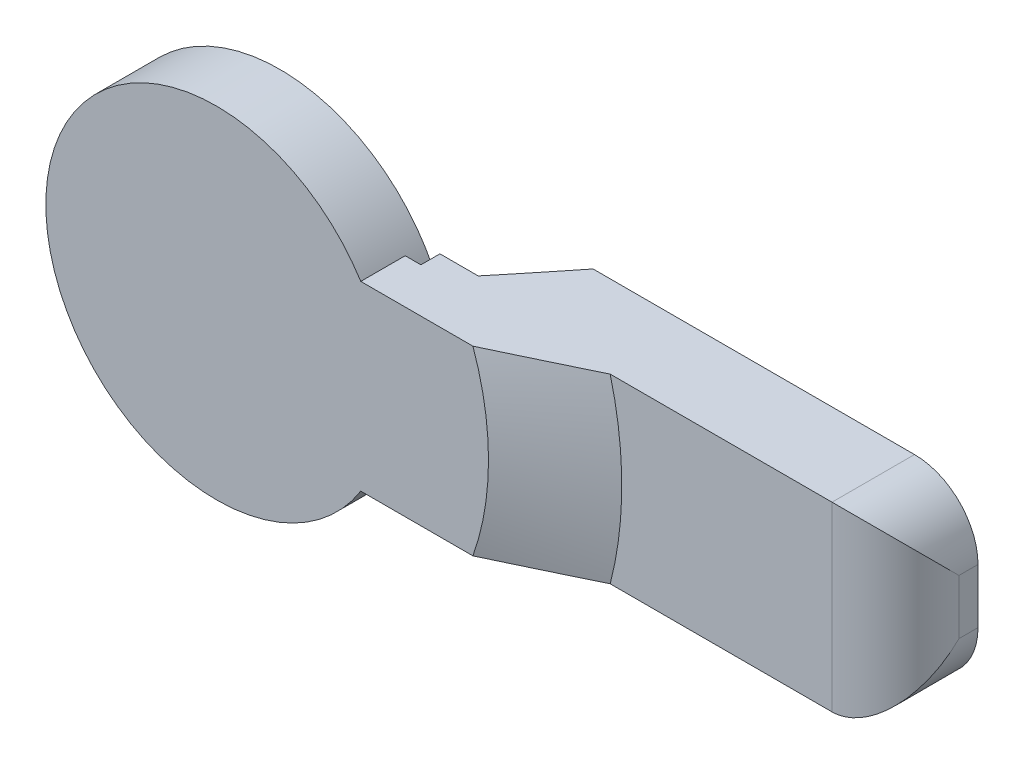
ISO-10303-21;
HEADER;
FILE_DESCRIPTION(('STEP AP214'),'2;1');
FILE_NAME('part.step','',(''),(''),'','','');
FILE_SCHEMA(('AUTOMOTIVE_DESIGN { 1 0 10303 214 1 1 1 1 }'));
ENDSEC;
DATA;
#1=APPLICATION_CONTEXT('core data for automotive mechanical design processes');
#2=APPLICATION_PROTOCOL_DEFINITION('international standard','automotive_design',2000,#1);
#3=PRODUCT_CONTEXT('',#1,'mechanical');
#4=PRODUCT('Part','Part','',(#3));
#5=PRODUCT_RELATED_PRODUCT_CATEGORY('part','',(#4));
#6=PRODUCT_DEFINITION_FORMATION('','',#4);
#7=PRODUCT_DEFINITION_CONTEXT('part definition',#1,'design');
#8=PRODUCT_DEFINITION('design','',#6,#7);
#9=PRODUCT_DEFINITION_SHAPE('','',#8);
#10=(LENGTH_UNIT() NAMED_UNIT(*) SI_UNIT(.MILLI.,.METRE.));
#11=(NAMED_UNIT(*) PLANE_ANGLE_UNIT() SI_UNIT($,.RADIAN.));
#12=(NAMED_UNIT(*) SI_UNIT($,.STERADIAN.) SOLID_ANGLE_UNIT());
#13=UNCERTAINTY_MEASURE_WITH_UNIT(LENGTH_MEASURE(1.E-05),#10,'distance_accuracy_value','');
#14=(GEOMETRIC_REPRESENTATION_CONTEXT(3) GLOBAL_UNCERTAINTY_ASSIGNED_CONTEXT((#13)) GLOBAL_UNIT_ASSIGNED_CONTEXT((#10,
#11,#12)) REPRESENTATION_CONTEXT('',''));
#15=CARTESIAN_POINT('',(0.,0.,0.));
#16=DIRECTION('',(0.,0.,1.));
#17=DIRECTION('',(1.,0.,0.));
#18=AXIS2_PLACEMENT_3D('',#15,#16,#17);
#19=CARTESIAN_POINT('',(0.,0.,38.));
#20=DIRECTION('',(0.,0.,-1.));
#21=DIRECTION('',(1.,0.,0.));
#22=AXIS2_PLACEMENT_3D('',#19,#20,#21);
#23=PLANE('',#22);
#24=CARTESIAN_POINT('',(0.,0.,38.));
#25=DIRECTION('',(0.,0.,1.));
#26=DIRECTION('',(1.,0.,0.));
#27=AXIS2_PLACEMENT_3D('',#24,#25,#26);
#28=CIRCLE('',#27,25.125);
#29=CARTESIAN_POINT('',(25.125,0.,38.));
#30=VERTEX_POINT('',#29);
#31=EDGE_CURVE('E247',#30,#30,#28,.F.);
#32=ORIENTED_EDGE('',*,*,#31,.T.);
#33=EDGE_LOOP('',(#32));
#34=FACE_BOUND('',#33,.T.);
#35=CARTESIAN_POINT('',(0.,0.,38.));
#36=DIRECTION('',(0.,0.,1.));
#37=DIRECTION('',(1.,0.,0.));
#38=AXIS2_PLACEMENT_3D('',#35,#36,#37);
#39=CIRCLE('',#38,5.);
#40=CARTESIAN_POINT('',(5.,0.,38.));
#41=VERTEX_POINT('',#40);
#42=EDGE_CURVE('E167',#41,#41,#39,.T.);
#43=ORIENTED_EDGE('',*,*,#42,.T.);
#44=EDGE_LOOP('',(#43));
#45=FACE_BOUND('',#44,.T.);
#46=ADVANCED_FACE('F40',(#34,#45),#23,.T.);
#47=CARTESIAN_POINT('',(0.,0.,30.));
#48=DIRECTION('',(0.,0.,-1.));
#49=DIRECTION('',(1.,0.,0.));
#50=AXIS2_PLACEMENT_3D('',#47,#48,#49);
#51=PLANE('',#50);
#52=CARTESIAN_POINT('',(0.,0.,30.));
#53=DIRECTION('',(0.,0.,1.));
#54=DIRECTION('',(1.,0.,0.));
#55=AXIS2_PLACEMENT_3D('',#52,#53,#54);
#56=CIRCLE('',#55,25.125);
#57=CARTESIAN_POINT('',(25.125,0.,30.));
#58=VERTEX_POINT('',#57);
#59=EDGE_CURVE('E238',#58,#58,#56,.T.);
#60=ORIENTED_EDGE('',*,*,#59,.T.);
#61=EDGE_LOOP('',(#60));
#62=FACE_BOUND('',#61,.T.);
#63=CARTESIAN_POINT('',(0.,0.,30.));
#64=DIRECTION('',(0.,0.,1.));
#65=DIRECTION('',(1.,0.,0.));
#66=AXIS2_PLACEMENT_3D('',#63,#64,#65);
#67=CIRCLE('',#66,26.875);
#68=CARTESIAN_POINT('',(26.875,0.,30.));
#69=VERTEX_POINT('',#68);
#70=EDGE_CURVE('E241',#69,#69,#67,.T.);
#71=ORIENTED_EDGE('',*,*,#70,.F.);
#72=EDGE_LOOP('',(#71));
#73=FACE_BOUND('',#72,.T.);
#74=ADVANCED_FACE('F392',(#62,#73),#51,.T.);
#75=CARTESIAN_POINT('',(0.,0.,38.));
#76=DIRECTION('',(0.,0.,1.));
#77=DIRECTION('',(-1.,0.,0.));
#78=AXIS2_PLACEMENT_3D('',#75,#76,#77);
#79=CYLINDRICAL_SURFACE('',#78,26.875);
#80=ORIENTED_EDGE('',*,*,#70,.T.);
#81=EDGE_LOOP('',(#80));
#82=FACE_BOUND('',#81,.T.);
#83=CARTESIAN_POINT('',(0.,0.,40.));
#84=DIRECTION('',(0.,0.,1.));
#85=DIRECTION('',(1.,0.,0.));
#86=AXIS2_PLACEMENT_3D('',#83,#84,#85);
#87=CIRCLE('',#86,26.875);
#88=CARTESIAN_POINT('',(22.7484191830579,14.3099633008573,40.));
#89=VERTEX_POINT('',#88);
#90=CARTESIAN_POINT('',(22.7484191830579,-14.3099633008573,40.));
#91=VERTEX_POINT('',#90);
#92=EDGE_CURVE('E244',#89,#91,#87,.T.);
#93=ORIENTED_EDGE('',*,*,#92,.F.);
#94=DIRECTION('',(0.,0.,-1.));
#95=VECTOR('',#94,1.);
#96=CARTESIAN_POINT('',(22.7484191830579,14.3099633008573,33.));
#97=LINE('',#96,#95);
#98=CARTESIAN_POINT('',(22.7484191830579,14.3099633008573,33.));
#99=VERTEX_POINT('',#98);
#100=EDGE_CURVE('E228',#89,#99,#97,.T.);
#101=ORIENTED_EDGE('',*,*,#100,.T.);
#102=CARTESIAN_POINT('',(0.,0.,33.));
#103=DIRECTION('',(0.,0.,1.));
#104=DIRECTION('',(1.,0.,0.));
#105=AXIS2_PLACEMENT_3D('',#102,#103,#104);
#106=CIRCLE('',#105,26.875);
#107=CARTESIAN_POINT('',(22.7484191830579,-14.3099633008573,33.));
#108=VERTEX_POINT('',#107);
#109=EDGE_CURVE('E213',#108,#99,#106,.T.);
#110=ORIENTED_EDGE('',*,*,#109,.F.);
#111=DIRECTION('',(0.,0.,-1.));
#112=VECTOR('',#111,1.);
#113=CARTESIAN_POINT('',(22.7484191830579,-14.3099633008573,33.));
#114=LINE('',#113,#112);
#115=EDGE_CURVE('E235',#91,#108,#114,.T.);
#116=ORIENTED_EDGE('',*,*,#115,.F.);
#117=EDGE_LOOP('',(#93,#101,#110,#116));
#118=FACE_BOUND('',#117,.T.);
#119=ADVANCED_FACE('F275',(#82,#118),#79,.T.);
#120=CARTESIAN_POINT('',(0.,0.,40.));
#121=DIRECTION('',(0.,0.,-1.));
#122=DIRECTION('',(1.,0.,0.));
#123=AXIS2_PLACEMENT_3D('',#120,#121,#122);
#124=PLANE('',#123);
#125=ORIENTED_EDGE('',*,*,#92,.T.);
#126=DIRECTION('',(-1.,0.,0.));
#127=VECTOR('',#126,1.);
#128=CARTESIAN_POINT('',(0.,-14.3099633008573,40.));
#129=LINE('',#128,#127);
#130=CARTESIAN_POINT('',(40.4164641616277,-14.3099633008573,40.));
#131=VERTEX_POINT('',#130);
#132=EDGE_CURVE('E311',#91,#131,#129,.F.);
#133=ORIENTED_EDGE('',*,*,#132,.T.);
#134=CARTESIAN_POINT('',(0.,0.,40.));
#135=DIRECTION('',(0.,0.,1.));
#136=DIRECTION('',(1.,0.,0.));
#137=AXIS2_PLACEMENT_3D('',#134,#135,#136);
#138=CIRCLE('',#137,42.8750000000002);
#139=CARTESIAN_POINT('',(40.4164641616277,14.3099633008573,40.));
#140=VERTEX_POINT('',#139);
#141=EDGE_CURVE('E357',#140,#131,#138,.F.);
#142=ORIENTED_EDGE('',*,*,#141,.F.);
#143=DIRECTION('',(1.,0.,0.));
#144=VECTOR('',#143,1.);
#145=CARTESIAN_POINT('',(100.,14.3099633008573,40.));
#146=LINE('',#145,#144);
#147=EDGE_CURVE('E304',#89,#140,#146,.T.);
#148=ORIENTED_EDGE('',*,*,#147,.F.);
#149=EDGE_LOOP('',(#125,#133,#142,#148));
#150=FACE_BOUND('',#149,.T.);
#151=ADVANCED_FACE('F384',(#150),#124,.F.);
#152=CARTESIAN_POINT('',(0.,0.,30.));
#153=DIRECTION('',(0.,0.,1.));
#154=DIRECTION('',(1.,0.,0.));
#155=AXIS2_PLACEMENT_3D('',#152,#153,#154);
#156=CIRCLE('',#155,29.);
#157=CARTESIAN_POINT('',(25.2234999619029,-14.3099633008573,30.));
#158=VERTEX_POINT('',#157);
#159=CARTESIAN_POINT('',(25.2234999619029,14.3099633008573,30.));
#160=VERTEX_POINT('',#159);
#161=EDGE_CURVE('E203',#158,#160,#156,.T.);
#162=ORIENTED_EDGE('',*,*,#161,.T.);
#163=DIRECTION('',(1.,0.,0.));
#164=VECTOR('',#163,1.);
#165=CARTESIAN_POINT('',(100.,14.3099633008573,30.));
#166=LINE('',#165,#164);
#167=CARTESIAN_POINT('',(31.2548488290717,14.3099633008573,30.));
#168=VERTEX_POINT('',#167);
#169=EDGE_CURVE('E287',#160,#168,#166,.T.);
#170=ORIENTED_EDGE('',*,*,#169,.T.);
#171=CARTESIAN_POINT('',(0.,0.,30.));
#172=DIRECTION('',(0.,0.,1.));
#173=DIRECTION('',(1.,0.,0.));
#174=AXIS2_PLACEMENT_3D('',#171,#172,#173);
#175=CIRCLE('',#174,34.3750000000001);
#176=CARTESIAN_POINT('',(31.2548488290717,-14.3099633008573,30.));
#177=VERTEX_POINT('',#176);
#178=EDGE_CURVE('E358',#177,#168,#175,.T.);
#179=ORIENTED_EDGE('',*,*,#178,.F.);
#180=DIRECTION('',(-1.,0.,0.));
#181=VECTOR('',#180,1.);
#182=CARTESIAN_POINT('',(0.,-14.3099633008573,30.));
#183=LINE('',#182,#181);
#184=EDGE_CURVE('E261',#177,#158,#183,.T.);
#185=ORIENTED_EDGE('',*,*,#184,.T.);
#186=EDGE_LOOP('',(#162,#170,#179,#185));
#187=FACE_BOUND('',#186,.T.);
#188=ADVANCED_FACE('F367',(#187),#51,.T.);
#189=CARTESIAN_POINT('',(0.,0.,30.));
#190=DIRECTION('',(0.,0.,1.));
#191=DIRECTION('',(-1.,0.,0.));
#192=AXIS2_PLACEMENT_3D('',#189,#190,#191);
#193=CYLINDRICAL_SURFACE('',#192,25.125);
#194=ORIENTED_EDGE('',*,*,#59,.F.);
#195=EDGE_LOOP('',(#194));
#196=FACE_BOUND('',#195,.T.);
#197=ORIENTED_EDGE('',*,*,#31,.F.);
#198=EDGE_LOOP('',(#197));
#199=FACE_BOUND('',#198,.T.);
#200=ADVANCED_FACE('F390',(#196,#199),#193,.F.);
#201=CARTESIAN_POINT('',(100.,-14.3099633008573,33.));
#202=DIRECTION('',(0.,1.,0.));
#203=DIRECTION('',(-1.,0.,0.));
#204=AXIS2_PLACEMENT_3D('',#201,#202,#203);
#205=PLANE('',#204);
#206=DIRECTION('',(-1.,0.,0.));
#207=VECTOR('',#206,1.);
#208=CARTESIAN_POINT('',(100.,-14.3099633008573,20.));
#209=LINE('',#208,#207);
#210=CARTESIAN_POINT('',(90.,-14.3099633008573,20.));
#211=VERTEX_POINT('',#210);
#212=CARTESIAN_POINT('',(39.3540414103574,-14.3099633008573,20.));
#213=VERTEX_POINT('',#212);
#214=EDGE_CURVE('E221',#211,#213,#209,.T.);
#215=ORIENTED_EDGE('',*,*,#214,.F.);
#216=DIRECTION('',(0.,0.,-1.));
#217=VECTOR('',#216,1.);
#218=CARTESIAN_POINT('',(90.,-14.3099633008573,33.));
#219=LINE('',#218,#217);
#220=CARTESIAN_POINT('',(90.,-14.3099633008573,33.));
#221=VERTEX_POINT('',#220);
#222=EDGE_CURVE('E49',#211,#221,#219,.F.);
#223=ORIENTED_EDGE('',*,*,#222,.T.);
#224=DIRECTION('',(-1.,0.,0.));
#225=VECTOR('',#224,1.);
#226=CARTESIAN_POINT('',(100.,-14.3099633008573,33.));
#227=LINE('',#226,#225);
#228=CARTESIAN_POINT('',(55.0453501699111,-14.3099633008573,33.));
#229=VERTEX_POINT('',#228);
#230=EDGE_CURVE('E223',#221,#229,#227,.T.);
#231=ORIENTED_EDGE('',*,*,#230,.T.);
#232=CARTESIAN_POINT('',(22.7484191830579,-14.3099633008573,48.0000000000002));
#233=CARTESIAN_POINT('',(23.2931688216632,-14.3099633008573,47.7694252485658));
#234=CARTESIAN_POINT('',(23.8370881150449,-14.3099633008573,47.5368988022653));
#235=CARTESIAN_POINT('',(24.9234588988973,-14.3099633008573,47.0684569490064));
#236=CARTESIAN_POINT('',(25.4659104054992,-14.3099633008573,46.8325415794743));
#237=CARTESIAN_POINT('',(26.549527642955,-14.3099633008573,46.3578412179645));
#238=CARTESIAN_POINT('',(27.0906934271248,-14.3099633008573,46.1190563475565));
#239=CARTESIAN_POINT('',(28.1719220644972,-14.3099633008573,45.6389994352556));
#240=CARTESIAN_POINT('',(28.7119849141987,-14.3099633008573,45.3977273854819));
#241=CARTESIAN_POINT('',(30.330619238033,-14.3099633008573,44.6707471362914));
#242=CARTESIAN_POINT('',(31.4077478829394,-14.3099633008573,44.181825864776));
#243=CARTESIAN_POINT('',(33.5590309628089,-14.3099633008573,43.1974611818497));
#244=CARTESIAN_POINT('',(34.6331853600071,-14.3099633008573,42.7020176880796));
#245=CARTESIAN_POINT('',(36.7789779052465,-14.3099633008573,41.7061223514035));
#246=CARTESIAN_POINT('',(37.8506163972555,-14.3099633008573,41.2056712490891));
#247=CARTESIAN_POINT('',(39.9919989156063,-14.3099633008573,40.2007473987829));
#248=CARTESIAN_POINT('',(41.0617429500997,-14.3099633008573,39.6962746681471));
#249=CARTESIAN_POINT('',(43.1997217386016,-14.3099633008573,38.6840778172772));
#250=CARTESIAN_POINT('',(44.267956456428,-14.3099633008573,38.1763536206591));
#251=CARTESIAN_POINT('',(46.4031658905237,-14.3099633008573,37.1582618985038));
#252=CARTESIAN_POINT('',(47.47014060601,-14.3099633008573,36.6478943713251));
#253=CARTESIAN_POINT('',(49.079465590941,-14.3099633008573,35.8760764017664));
#254=CARTESIAN_POINT('',(49.6222043222016,-14.3099633008573,35.6154354376833));
#255=CARTESIAN_POINT('',(50.7074296415187,-14.3099633008573,35.093637823733));
#256=CARTESIAN_POINT('',(51.2499162311441,-14.3099633008573,34.8324811771286));
#257=CARTESIAN_POINT('',(52.3346795169204,-14.3099633008573,34.3096874384142));
#258=CARTESIAN_POINT('',(52.8769562056906,-14.3099633008573,34.0480503309917));
#259=CARTESIAN_POINT('',(53.9613038124597,-14.3099633008573,33.524341226021));
#260=CARTESIAN_POINT('',(54.5033747291247,-14.3099633008573,33.2622692257111));
#261=CARTESIAN_POINT('',(55.0453501699111,-14.3099633008573,33.));
#262=B_SPLINE_CURVE_WITH_KNOTS('',3,(#232,#233,#234,#235,#236,#237,#238,#239,#240,#241,#242,
#243,#244,#245,#246,#247,#248,#249,#250,#251,#252,#253,#254,#255,#256,#257,#258,#259,#260,#261),
.UNSPECIFIED.,.F.,.F.,(4,2,2,2,2,2,2,2,2,2,2,2,2,2,4),(0.,1.77460369200208,3.54918780082176,
5.32369699049992,7.09821180451367,10.6468763877609,14.1955858247862,17.7437779685368,
21.2919548076022,24.8402153090328,28.3884780143063,30.1947146021795,32.0009397973675,
33.8072235925301,35.6135189024584),.UNSPECIFIED.);
#263=EDGE_CURVE('E305',#131,#229,#262,.T.);
#264=ORIENTED_EDGE('',*,*,#263,.F.);
#265=ORIENTED_EDGE('',*,*,#132,.F.);
#266=ORIENTED_EDGE('',*,*,#115,.T.);
#267=DIRECTION('',(1.,0.,0.));
#268=VECTOR('',#267,1.);
#269=CARTESIAN_POINT('',(0.,-14.3099633008573,33.));
#270=LINE('',#269,#268);
#271=CARTESIAN_POINT('',(25.2234999619029,-14.3099633008573,33.));
#272=VERTEX_POINT('',#271);
#273=EDGE_CURVE('E206',#108,#272,#270,.T.);
#274=ORIENTED_EDGE('',*,*,#273,.T.);
#275=DIRECTION('',(0.,0.,-1.));
#276=VECTOR('',#275,1.);
#277=CARTESIAN_POINT('',(25.2234999619029,-14.3099633008573,33.));
#278=LINE('',#277,#276);
#279=EDGE_CURVE('E216',#272,#158,#278,.T.);
#280=ORIENTED_EDGE('',*,*,#279,.T.);
#281=ORIENTED_EDGE('',*,*,#184,.F.);
#282=CARTESIAN_POINT('',(39.3540414103574,-14.3099633008573,20.));
#283=CARTESIAN_POINT('',(38.918200396022,-14.3099633008573,20.5461330284241));
#284=CARTESIAN_POINT('',(38.4818466587863,-14.3099633008573,21.0918569019047));
#285=CARTESIAN_POINT('',(37.6080013020913,-14.3099633008573,22.1823937824477));
#286=CARTESIAN_POINT('',(37.1705096813851,-14.3099633008573,22.7272067885109));
#287=CARTESIAN_POINT('',(35.8561915050751,-14.3099633008573,24.3601006955468));
#288=CARTESIAN_POINT('',(34.9774910794101,-14.3099633008573,25.446674806313));
#289=CARTESIAN_POINT('',(33.2139466652834,-14.3099633008573,27.6148544654818));
#290=CARTESIAN_POINT('',(32.3291025995349,-14.3099633008573,28.6964599510936));
#291=CARTESIAN_POINT('',(30.9960731395238,-14.3099633008573,30.3141495315672));
#292=CARTESIAN_POINT('',(30.5507617427346,-14.3099633008573,30.8526021404582));
#293=CARTESIAN_POINT('',(29.6579675153371,-14.3099633008573,31.9277073422273));
#294=CARTESIAN_POINT('',(29.2104846763867,-14.3099633008573,32.4643599281768));
#295=CARTESIAN_POINT('',(28.7617901968588,-14.3099633008573,33.));
#296=B_SPLINE_CURVE_WITH_KNOTS('',3,(#282,#283,#284,#285,#286,#287,#288,#289,#290,#291,#292,
#293,#294,#295),.UNSPECIFIED.,.F.,.F.,(4,2,2,2,2,2,4),(0.,2.09617895840916,4.19236021476433,
8.38457569338143,12.5768440058506,14.6730500323726,16.7692641183333),.UNSPECIFIED.);
#297=EDGE_CURVE('E253',#213,#177,#296,.T.);
#298=ORIENTED_EDGE('',*,*,#297,.F.);
#299=EDGE_LOOP('',(#215,#223,#231,#264,#265,#266,#274,#280,#281,#298));
#300=FACE_BOUND('',#299,.T.);
#301=ADVANCED_FACE('F263',(#300),#205,.F.);
#302=CARTESIAN_POINT('',(100.,14.3099633008573,33.));
#303=DIRECTION('',(0.,1.,0.));
#304=DIRECTION('',(-1.,0.,0.));
#305=AXIS2_PLACEMENT_3D('',#302,#303,#304);
#306=PLANE('',#305);
#307=DIRECTION('',(-1.,0.,0.));
#308=VECTOR('',#307,1.);
#309=CARTESIAN_POINT('',(100.,14.3099633008573,33.));
#310=LINE('',#309,#308);
#311=CARTESIAN_POINT('',(90.,14.3099633008573,33.));
#312=VERTEX_POINT('',#311);
#313=CARTESIAN_POINT('',(55.0453501699111,14.3099633008573,33.));
#314=VERTEX_POINT('',#313);
#315=EDGE_CURVE('E225',#312,#314,#310,.T.);
#316=ORIENTED_EDGE('',*,*,#315,.F.);
#317=DIRECTION('',(0.,0.,-1.));
#318=VECTOR('',#317,1.);
#319=CARTESIAN_POINT('',(90.,14.3099633008573,20.));
#320=LINE('',#319,#318);
#321=CARTESIAN_POINT('',(90.,14.3099633008573,20.));
#322=VERTEX_POINT('',#321);
#323=EDGE_CURVE('E11',#312,#322,#320,.T.);
#324=ORIENTED_EDGE('',*,*,#323,.T.);
#325=DIRECTION('',(-1.,0.,0.));
#326=VECTOR('',#325,1.);
#327=CARTESIAN_POINT('',(100.,14.3099633008573,20.));
#328=LINE('',#327,#326);
#329=CARTESIAN_POINT('',(39.3540414103574,14.3099633008573,20.));
#330=VERTEX_POINT('',#329);
#331=EDGE_CURVE('E230',#322,#330,#328,.T.);
#332=ORIENTED_EDGE('',*,*,#331,.T.);
#333=CARTESIAN_POINT('',(28.7617901968588,14.3099633008573,33.));
#334=CARTESIAN_POINT('',(29.2104846763867,14.3099633008573,32.4643599281768));
#335=CARTESIAN_POINT('',(29.6579675153371,14.3099633008573,31.9277073422273));
#336=CARTESIAN_POINT('',(30.5507617427346,14.3099633008573,30.8526021404582));
#337=CARTESIAN_POINT('',(30.9960731395238,14.3099633008573,30.3141495315672));
#338=CARTESIAN_POINT('',(32.3291025995349,14.3099633008573,28.6964599510936));
#339=CARTESIAN_POINT('',(33.2139466652834,14.3099633008573,27.6148544654818));
#340=CARTESIAN_POINT('',(34.9774910794101,14.3099633008573,25.446674806313));
#341=CARTESIAN_POINT('',(35.8561915050751,14.3099633008573,24.3601006955468));
#342=CARTESIAN_POINT('',(37.1705096813851,14.3099633008573,22.7272067885109));
#343=CARTESIAN_POINT('',(37.6080013020913,14.3099633008573,22.1823937824477));
#344=CARTESIAN_POINT('',(38.4818466587863,14.3099633008573,21.0918569019047));
#345=CARTESIAN_POINT('',(38.918200396022,14.3099633008573,20.5461330284241));
#346=CARTESIAN_POINT('',(39.3540414103574,14.3099633008573,20.));
#347=B_SPLINE_CURVE_WITH_KNOTS('',3,(#333,#334,#335,#336,#337,#338,#339,#340,#341,#342,#343,
#344,#345,#346),.UNSPECIFIED.,.F.,.F.,(4,2,2,2,2,2,4),(0.,2.09621408596067,4.19242011248273,
8.38468842495187,12.576903903569,14.6730851599241,16.7692641183333),.UNSPECIFIED.);
#348=EDGE_CURVE('E280',#168,#330,#347,.T.);
#349=ORIENTED_EDGE('',*,*,#348,.F.);
#350=ORIENTED_EDGE('',*,*,#169,.F.);
#351=DIRECTION('',(0.,0.,-1.));
#352=VECTOR('',#351,1.);
#353=CARTESIAN_POINT('',(25.2234999619029,14.3099633008573,33.));
#354=LINE('',#353,#352);
#355=CARTESIAN_POINT('',(25.2234999619029,14.3099633008573,33.));
#356=VERTEX_POINT('',#355);
#357=EDGE_CURVE('E219',#356,#160,#354,.T.);
#358=ORIENTED_EDGE('',*,*,#357,.F.);
#359=DIRECTION('',(-1.,0.,0.));
#360=VECTOR('',#359,1.);
#361=CARTESIAN_POINT('',(0.,14.3099633008573,33.));
#362=LINE('',#361,#360);
#363=EDGE_CURVE('E211',#356,#99,#362,.T.);
#364=ORIENTED_EDGE('',*,*,#363,.T.);
#365=ORIENTED_EDGE('',*,*,#100,.F.);
#366=ORIENTED_EDGE('',*,*,#147,.T.);
#367=CARTESIAN_POINT('',(55.0453501699111,14.3099633008573,33.));
#368=CARTESIAN_POINT('',(53.7096242638324,14.3099633008573,33.6463353033571));
#369=CARTESIAN_POINT('',(52.373344674416,14.3099633008573,34.2915306956964));
#370=CARTESIAN_POINT('',(49.6993404675902,14.3099633008573,35.5789099466433));
#371=CARTESIAN_POINT('',(48.3616158541539,14.3099633008573,36.2210938135055));
#372=CARTESIAN_POINT('',(45.6845406500232,14.3099633008573,37.5016433907294));
#373=CARTESIAN_POINT('',(44.3451902786643,14.3099633008573,38.1400095593265));
#374=CARTESIAN_POINT('',(41.6641986291977,14.3099633008573,39.4119411749156));
#375=CARTESIAN_POINT('',(40.3225573353683,14.3099633008573,40.0455065887983));
#376=CARTESIAN_POINT('',(37.6361495167242,14.3099633008573,41.3064270121818));
#377=CARTESIAN_POINT('',(36.2913826170486,14.3099633008573,41.9337812236672));
#378=CARTESIAN_POINT('',(33.5979667249995,14.3099633008573,43.1800570154644));
#379=CARTESIAN_POINT('',(32.2493178038109,14.3099633008573,43.7989787492251));
#380=CARTESIAN_POINT('',(30.2222792758602,14.3099633008573,44.7186394124791));
#381=CARTESIAN_POINT('',(29.5458773880585,14.3099633008573,45.0237591949897));
#382=CARTESIAN_POINT('',(28.1915071843088,14.3099633008573,45.6304952520881));
#383=CARTESIAN_POINT('',(27.5135388765634,14.3099633008573,45.9321115449726));
#384=CARTESIAN_POINT('',(26.1557117746274,14.3099633008573,46.531177453783));
#385=CARTESIAN_POINT('',(25.4758528685187,14.3099633008573,46.8286268164622));
#386=CARTESIAN_POINT('',(24.1139012875216,14.3099633008573,47.4183977225054));
#387=CARTESIAN_POINT('',(23.4318085724073,14.3099633008573,47.7107191729173));
#388=CARTESIAN_POINT('',(22.7484191830579,14.3099633008573,48.0000000000002));
#389=B_SPLINE_CURVE_WITH_KNOTS('',3,(#367,#368,#369,#370,#371,#372,#373,#374,#375,#376,#377,
#378,#379,#380,#381,#382,#383,#384,#385,#386,#387,#388),.UNSPECIFIED.,.F.,.F.,(4,2,2,2,2,2,2,2,
2,2,4),(0.,4.45165561746435,8.9032990258048,13.3543969277941,17.8055254996947,22.2572187189001,
26.7088308205643,28.9349312441426,31.1610200368949,33.3872435391721,35.6135073538883),.UNSPECIFIED.);
#390=EDGE_CURVE('E297',#314,#140,#389,.T.);
#391=ORIENTED_EDGE('',*,*,#390,.F.);
#392=EDGE_LOOP('',(#316,#324,#332,#349,#350,#358,#364,#365,#366,#391));
#393=FACE_BOUND('',#392,.T.);
#394=ADVANCED_FACE('F289',(#393),#306,.T.);
#395=CARTESIAN_POINT('',(100.,14.3099633008573,33.));
#396=DIRECTION('',(-1.,0.,0.));
#397=DIRECTION('',(0.,0.,-1.));
#398=AXIS2_PLACEMENT_3D('',#395,#396,#397);
#399=PLANE('',#398);
#400=DIRECTION('',(0.,-1.,0.));
#401=VECTOR('',#400,1.);
#402=CARTESIAN_POINT('',(100.,-14.3099633008573,23.));
#403=LINE('',#402,#401);
#404=CARTESIAN_POINT('',(100.,4.30996330085727,23.));
#405=VERTEX_POINT('',#404);
#406=CARTESIAN_POINT('',(100.,-4.30996330085727,23.));
#407=VERTEX_POINT('',#406);
#408=EDGE_CURVE('E318',#405,#407,#403,.T.);
#409=ORIENTED_EDGE('',*,*,#408,.T.);
#410=DIRECTION('',(0.,0.,-1.));
#411=VECTOR('',#410,1.);
#412=CARTESIAN_POINT('',(100.,-4.30996330085727,33.));
#413=LINE('',#412,#411);
#414=CARTESIAN_POINT('',(100.,-4.30996330085727,20.));
#415=VERTEX_POINT('',#414);
#416=EDGE_CURVE('E321',#407,#415,#413,.T.);
#417=ORIENTED_EDGE('',*,*,#416,.T.);
#418=DIRECTION('',(0.,-1.,0.));
#419=VECTOR('',#418,1.);
#420=CARTESIAN_POINT('',(100.,14.3099633008573,20.));
#421=LINE('',#420,#419);
#422=CARTESIAN_POINT('',(100.,4.30996330085727,20.));
#423=VERTEX_POINT('',#422);
#424=EDGE_CURVE('E226',#423,#415,#421,.T.);
#425=ORIENTED_EDGE('',*,*,#424,.F.);
#426=DIRECTION('',(0.,0.,-1.));
#427=VECTOR('',#426,1.);
#428=CARTESIAN_POINT('',(100.,4.30996330085727,33.));
#429=LINE('',#428,#427);
#430=EDGE_CURVE('E314',#423,#405,#429,.F.);
#431=ORIENTED_EDGE('',*,*,#430,.T.);
#432=EDGE_LOOP('',(#409,#417,#425,#431));
#433=FACE_BOUND('',#432,.T.);
#434=ADVANCED_FACE('F293',(#433),#399,.F.);
#435=CARTESIAN_POINT('',(0.,0.,33.));
#436=DIRECTION('',(0.,0.,1.));
#437=DIRECTION('',(-1.,0.,0.));
#438=AXIS2_PLACEMENT_3D('',#435,#436,#437);
#439=PLANE('',#438);
#440=ORIENTED_EDGE('',*,*,#230,.F.);
#441=DIRECTION('',(0.,-1.,0.));
#442=VECTOR('',#441,1.);
#443=CARTESIAN_POINT('',(90.,14.3099633008573,33.));
#444=LINE('',#443,#442);
#445=EDGE_CURVE('E323',#221,#312,#444,.F.);
#446=ORIENTED_EDGE('',*,*,#445,.T.);
#447=ORIENTED_EDGE('',*,*,#315,.T.);
#448=CARTESIAN_POINT('',(0.,0.,33.));
#449=DIRECTION('',(0.,0.,-1.));
#450=DIRECTION('',(-1.,0.,0.));
#451=AXIS2_PLACEMENT_3D('',#448,#449,#450);
#452=CIRCLE('',#451,56.8750000000001);
#453=EDGE_CURVE('E353',#229,#314,#452,.F.);
#454=ORIENTED_EDGE('',*,*,#453,.F.);
#455=EDGE_LOOP('',(#440,#446,#447,#454));
#456=FACE_BOUND('',#455,.T.);
#457=ADVANCED_FACE('F351',(#456),#439,.T.);
#458=CARTESIAN_POINT('',(0.,0.,20.));
#459=DIRECTION('',(0.,0.,1.));
#460=DIRECTION('',(-1.,0.,0.));
#461=AXIS2_PLACEMENT_3D('',#458,#459,#460);
#462=PLANE('',#461);
#463=ORIENTED_EDGE('',*,*,#424,.T.);
#464=CARTESIAN_POINT('',(90.,-4.30996330085727,20.));
#465=DIRECTION('',(0.,0.,1.));
#466=DIRECTION('',(1.,0.,0.));
#467=AXIS2_PLACEMENT_3D('',#464,#465,#466);
#468=CIRCLE('',#467,10.);
#469=EDGE_CURVE('E57',#415,#211,#468,.F.);
#470=ORIENTED_EDGE('',*,*,#469,.T.);
#471=ORIENTED_EDGE('',*,*,#214,.T.);
#472=CARTESIAN_POINT('',(0.,0.,20.));
#473=DIRECTION('',(0.,0.,-1.));
#474=DIRECTION('',(-1.,0.,0.));
#475=AXIS2_PLACEMENT_3D('',#472,#473,#474);
#476=CIRCLE('',#475,41.8750000000002);
#477=EDGE_CURVE('E250',#330,#213,#476,.T.);
#478=ORIENTED_EDGE('',*,*,#477,.F.);
#479=ORIENTED_EDGE('',*,*,#331,.F.);
#480=CARTESIAN_POINT('',(90.,4.30996330085727,20.));
#481=DIRECTION('',(0.,0.,1.));
#482=DIRECTION('',(1.,0.,0.));
#483=AXIS2_PLACEMENT_3D('',#480,#481,#482);
#484=CIRCLE('',#483,10.);
#485=EDGE_CURVE('E325',#322,#423,#484,.F.);
#486=ORIENTED_EDGE('',*,*,#485,.T.);
#487=EDGE_LOOP('',(#463,#470,#471,#478,#479,#486));
#488=FACE_BOUND('',#487,.T.);
#489=ADVANCED_FACE('F273',(#488),#462,.F.);
#490=CARTESIAN_POINT('',(0.,0.,20.));
#491=DIRECTION('',(0.,0.,-1.));
#492=DIRECTION('',(1.,0.,0.));
#493=AXIS2_PLACEMENT_3D('',#490,#491,#492);
#494=CONICAL_SURFACE('',#493,41.8750000000002,0.643501108793286);
#495=ORIENTED_EDGE('',*,*,#348,.T.);
#496=ORIENTED_EDGE('',*,*,#477,.T.);
#497=ORIENTED_EDGE('',*,*,#297,.T.);
#498=ORIENTED_EDGE('',*,*,#178,.T.);
#499=EDGE_LOOP('',(#495,#496,#497,#498));
#500=FACE_BOUND('',#499,.T.);
#501=ADVANCED_FACE('F267',(#500),#494,.F.);
#502=CARTESIAN_POINT('',(0.,0.,48.0000000000002));
#503=DIRECTION('',(0.,0.,-1.));
#504=DIRECTION('',(1.,0.,0.));
#505=AXIS2_PLACEMENT_3D('',#502,#503,#504);
#506=CONICAL_SURFACE('',#505,26.875,1.10714871779409);
#507=ORIENTED_EDGE('',*,*,#390,.T.);
#508=ORIENTED_EDGE('',*,*,#141,.T.);
#509=ORIENTED_EDGE('',*,*,#263,.T.);
#510=ORIENTED_EDGE('',*,*,#453,.T.);
#511=EDGE_LOOP('',(#507,#508,#509,#510));
#512=FACE_BOUND('',#511,.T.);
#513=ADVANCED_FACE('F272',(#512),#506,.T.);
#514=CARTESIAN_POINT('',(0.,0.,33.));
#515=DIRECTION('',(0.,0.,-1.));
#516=DIRECTION('',(1.,0.,0.));
#517=AXIS2_PLACEMENT_3D('',#514,#515,#516);
#518=CYLINDRICAL_SURFACE('',#517,29.);
#519=ORIENTED_EDGE('',*,*,#161,.F.);
#520=ORIENTED_EDGE('',*,*,#279,.F.);
#521=CARTESIAN_POINT('',(0.,0.,33.));
#522=DIRECTION('',(0.,0.,1.));
#523=DIRECTION('',(1.,0.,0.));
#524=AXIS2_PLACEMENT_3D('',#521,#522,#523);
#525=CIRCLE('',#524,29.);
#526=EDGE_CURVE('E209',#272,#356,#525,.T.);
#527=ORIENTED_EDGE('',*,*,#526,.T.);
#528=ORIENTED_EDGE('',*,*,#357,.T.);
#529=EDGE_LOOP('',(#519,#520,#527,#528));
#530=FACE_BOUND('',#529,.T.);
#531=ADVANCED_FACE('F374',(#530),#518,.F.);
#532=CARTESIAN_POINT('',(0.,0.,33.));
#533=DIRECTION('',(0.,0.,-1.));
#534=DIRECTION('',(1.,0.,0.));
#535=AXIS2_PLACEMENT_3D('',#532,#533,#534);
#536=PLANE('',#535);
#537=ORIENTED_EDGE('',*,*,#273,.F.);
#538=ORIENTED_EDGE('',*,*,#109,.T.);
#539=ORIENTED_EDGE('',*,*,#363,.F.);
#540=ORIENTED_EDGE('',*,*,#526,.F.);
#541=EDGE_LOOP('',(#537,#538,#539,#540));
#542=FACE_BOUND('',#541,.T.);
#543=ADVANCED_FACE('F377',(#542),#536,.T.);
#544=CARTESIAN_POINT('',(0.,0.,32.));
#545=DIRECTION('',(0.,0.,-1.));
#546=DIRECTION('',(1.,0.,0.));
#547=AXIS2_PLACEMENT_3D('',#544,#545,#546);
#548=PLANE('',#547);
#549=CARTESIAN_POINT('',(0.,0.,32.));
#550=DIRECTION('',(0.,0.,1.));
#551=DIRECTION('',(1.,0.,0.));
#552=AXIS2_PLACEMENT_3D('',#549,#550,#551);
#553=CIRCLE('',#552,5.);
#554=CARTESIAN_POINT('',(5.,0.,32.));
#555=VERTEX_POINT('',#554);
#556=EDGE_CURVE('E200',#555,#555,#553,.T.);
#557=ORIENTED_EDGE('',*,*,#556,.F.);
#558=EDGE_LOOP('',(#557));
#559=FACE_BOUND('',#558,.T.);
#560=DIRECTION('',(1.,0.,0.));
#561=VECTOR('',#560,1.);
#562=CARTESIAN_POINT('',(-2.59807621135332,-1.5,32.));
#563=LINE('',#562,#561);
#564=CARTESIAN_POINT('',(-2.59807621135332,-1.5,32.));
#565=VERTEX_POINT('',#564);
#566=CARTESIAN_POINT('',(2.59807621135332,-1.5,32.));
#567=VERTEX_POINT('',#566);
#568=EDGE_CURVE('E174',#565,#567,#563,.T.);
#569=ORIENTED_EDGE('',*,*,#568,.T.);
#570=CARTESIAN_POINT('',(0.,0.,32.));
#571=DIRECTION('',(0.,0.,1.));
#572=DIRECTION('',(1.,0.,0.));
#573=AXIS2_PLACEMENT_3D('',#570,#571,#572);
#574=CIRCLE('',#573,3.);
#575=CARTESIAN_POINT('',(2.59807621135332,1.5,32.));
#576=VERTEX_POINT('',#575);
#577=EDGE_CURVE('E182',#567,#576,#574,.T.);
#578=ORIENTED_EDGE('',*,*,#577,.T.);
#579=DIRECTION('',(-1.,0.,0.));
#580=VECTOR('',#579,1.);
#581=CARTESIAN_POINT('',(-2.59807621135332,1.5,32.));
#582=LINE('',#581,#580);
#583=CARTESIAN_POINT('',(-2.59807621135332,1.5,32.));
#584=VERTEX_POINT('',#583);
#585=EDGE_CURVE('E176',#576,#584,#582,.T.);
#586=ORIENTED_EDGE('',*,*,#585,.T.);
#587=CARTESIAN_POINT('',(0.,0.,32.));
#588=DIRECTION('',(0.,0.,1.));
#589=DIRECTION('',(1.,0.,0.));
#590=AXIS2_PLACEMENT_3D('',#587,#588,#589);
#591=CIRCLE('',#590,3.);
#592=EDGE_CURVE('E160',#584,#565,#591,.T.);
#593=ORIENTED_EDGE('',*,*,#592,.T.);
#594=EDGE_LOOP('',(#569,#578,#586,#593));
#595=FACE_BOUND('',#594,.T.);
#596=ADVANCED_FACE('F172',(#559,#595),#548,.T.);
#597=CARTESIAN_POINT('',(0.,0.,32.));
#598=DIRECTION('',(0.,0.,1.));
#599=DIRECTION('',(-1.,0.,0.));
#600=AXIS2_PLACEMENT_3D('',#597,#598,#599);
#601=CYLINDRICAL_SURFACE('',#600,5.);
#602=ORIENTED_EDGE('',*,*,#556,.T.);
#603=EDGE_LOOP('',(#602));
#604=FACE_BOUND('',#603,.T.);
#605=ORIENTED_EDGE('',*,*,#42,.F.);
#606=EDGE_LOOP('',(#605));
#607=FACE_BOUND('',#606,.T.);
#608=ADVANCED_FACE('F423',(#604,#607),#601,.T.);
#609=CARTESIAN_POINT('',(0.,0.,32.));
#610=DIRECTION('',(0.,0.,1.));
#611=DIRECTION('',(-1.,0.,0.));
#612=AXIS2_PLACEMENT_3D('',#609,#610,#611);
#613=CYLINDRICAL_SURFACE('',#612,3.);
#614=CARTESIAN_POINT('',(0.,0.,38.));
#615=DIRECTION('',(0.,0.,1.));
#616=DIRECTION('',(1.,0.,0.));
#617=AXIS2_PLACEMENT_3D('',#614,#615,#616);
#618=CIRCLE('',#617,3.);
#619=CARTESIAN_POINT('',(-2.59807621135332,1.5,38.));
#620=VERTEX_POINT('',#619);
#621=CARTESIAN_POINT('',(-2.59807621135332,-1.5,38.));
#622=VERTEX_POINT('',#621);
#623=EDGE_CURVE('E163',#620,#622,#618,.T.);
#624=ORIENTED_EDGE('',*,*,#623,.T.);
#625=DIRECTION('',(0.,0.,1.));
#626=VECTOR('',#625,1.);
#627=CARTESIAN_POINT('',(-2.59807621135332,-1.5,32.));
#628=LINE('',#627,#626);
#629=EDGE_CURVE('E156',#565,#622,#628,.T.);
#630=ORIENTED_EDGE('',*,*,#629,.F.);
#631=ORIENTED_EDGE('',*,*,#592,.F.);
#632=DIRECTION('',(0.,0.,1.));
#633=VECTOR('',#632,1.);
#634=CARTESIAN_POINT('',(-2.59807621135332,1.5,32.));
#635=LINE('',#634,#633);
#636=EDGE_CURVE('E187',#584,#620,#635,.T.);
#637=ORIENTED_EDGE('',*,*,#636,.T.);
#638=EDGE_LOOP('',(#624,#630,#631,#637));
#639=FACE_BOUND('',#638,.T.);
#640=ADVANCED_FACE('F158',(#639),#613,.F.);
#641=CARTESIAN_POINT('',(-2.59807621135332,-1.5,32.));
#642=DIRECTION('',(0.,1.,0.));
#643=DIRECTION('',(-1.,0.,0.));
#644=AXIS2_PLACEMENT_3D('',#641,#642,#643);
#645=PLANE('',#644);
#646=DIRECTION('',(1.,0.,0.));
#647=VECTOR('',#646,1.);
#648=CARTESIAN_POINT('',(-2.59807621135332,-1.5,38.));
#649=LINE('',#648,#647);
#650=CARTESIAN_POINT('',(2.59807621135332,-1.5,38.));
#651=VERTEX_POINT('',#650);
#652=EDGE_CURVE('E189',#622,#651,#649,.T.);
#653=ORIENTED_EDGE('',*,*,#652,.T.);
#654=DIRECTION('',(0.,0.,1.));
#655=VECTOR('',#654,1.);
#656=CARTESIAN_POINT('',(2.59807621135332,-1.5,32.));
#657=LINE('',#656,#655);
#658=EDGE_CURVE('E168',#567,#651,#657,.T.);
#659=ORIENTED_EDGE('',*,*,#658,.F.);
#660=ORIENTED_EDGE('',*,*,#568,.F.);
#661=ORIENTED_EDGE('',*,*,#629,.T.);
#662=EDGE_LOOP('',(#653,#659,#660,#661));
#663=FACE_BOUND('',#662,.T.);
#664=ADVANCED_FACE('F179',(#663),#645,.T.);
#665=CARTESIAN_POINT('',(0.,0.,32.));
#666=DIRECTION('',(0.,0.,1.));
#667=DIRECTION('',(-1.,0.,0.));
#668=AXIS2_PLACEMENT_3D('',#665,#666,#667);
#669=CYLINDRICAL_SURFACE('',#668,3.);
#670=CARTESIAN_POINT('',(0.,0.,38.));
#671=DIRECTION('',(0.,0.,1.));
#672=DIRECTION('',(1.,0.,0.));
#673=AXIS2_PLACEMENT_3D('',#670,#671,#672);
#674=CIRCLE('',#673,3.);
#675=CARTESIAN_POINT('',(2.59807621135332,1.5,38.));
#676=VERTEX_POINT('',#675);
#677=EDGE_CURVE('E191',#651,#676,#674,.T.);
#678=ORIENTED_EDGE('',*,*,#677,.T.);
#679=DIRECTION('',(0.,0.,1.));
#680=VECTOR('',#679,1.);
#681=CARTESIAN_POINT('',(2.59807621135332,1.5,32.));
#682=LINE('',#681,#680);
#683=EDGE_CURVE('E196',#576,#676,#682,.T.);
#684=ORIENTED_EDGE('',*,*,#683,.F.);
#685=ORIENTED_EDGE('',*,*,#577,.F.);
#686=ORIENTED_EDGE('',*,*,#658,.T.);
#687=EDGE_LOOP('',(#678,#684,#685,#686));
#688=FACE_BOUND('',#687,.T.);
#689=ADVANCED_FACE('F410',(#688),#669,.F.);
#690=CARTESIAN_POINT('',(-2.59807621135332,1.5,32.));
#691=DIRECTION('',(0.,-1.,0.));
#692=DIRECTION('',(0.,0.,1.));
#693=AXIS2_PLACEMENT_3D('',#690,#691,#692);
#694=PLANE('',#693);
#695=DIRECTION('',(-1.,0.,0.));
#696=VECTOR('',#695,1.);
#697=CARTESIAN_POINT('',(-2.59807621135332,1.5,38.));
#698=LINE('',#697,#696);
#699=EDGE_CURVE('E177',#676,#620,#698,.T.);
#700=ORIENTED_EDGE('',*,*,#699,.T.);
#701=ORIENTED_EDGE('',*,*,#636,.F.);
#702=ORIENTED_EDGE('',*,*,#585,.F.);
#703=ORIENTED_EDGE('',*,*,#683,.T.);
#704=EDGE_LOOP('',(#700,#701,#702,#703));
#705=FACE_BOUND('',#704,.T.);
#706=ADVANCED_FACE('F404',(#705),#694,.T.);
#707=ORIENTED_EDGE('',*,*,#623,.F.);
#708=ORIENTED_EDGE('',*,*,#699,.F.);
#709=ORIENTED_EDGE('',*,*,#677,.F.);
#710=ORIENTED_EDGE('',*,*,#652,.F.);
#711=EDGE_LOOP('',(#707,#708,#709,#710));
#712=FACE_BOUND('',#711,.T.);
#713=ADVANCED_FACE('F397',(#712),#23,.T.);
#714=CARTESIAN_POINT('',(90.,4.30996330085727,33.));
#715=DIRECTION('',(0.,0.,1.));
#716=DIRECTION('',(1.,0.,0.));
#717=AXIS2_PLACEMENT_3D('',#714,#715,#716);
#718=CYLINDRICAL_SURFACE('',#717,10.);
#719=ORIENTED_EDGE('',*,*,#485,.F.);
#720=ORIENTED_EDGE('',*,*,#323,.F.);
#721=CARTESIAN_POINT('',(90.,4.30996330085727,23.));
#722=DIRECTION('',(0.,-0.707106781186547,0.707106781186547));
#723=DIRECTION('',(0.,0.707106781186547,0.707106781186547));
#724=AXIS2_PLACEMENT_3D('',#721,#722,#723);
#725=ELLIPSE('',#724,14.1421356237309,10.);
#726=EDGE_CURVE('E44',#405,#312,#725,.T.);
#727=ORIENTED_EDGE('',*,*,#726,.F.);
#728=ORIENTED_EDGE('',*,*,#430,.F.);
#729=EDGE_LOOP('',(#719,#720,#727,#728));
#730=FACE_BOUND('',#729,.T.);
#731=ADVANCED_FACE('F42',(#730),#718,.T.);
#732=CARTESIAN_POINT('',(90.,-4.30996330085727,33.));
#733=DIRECTION('',(0.,0.,-1.));
#734=DIRECTION('',(-1.,0.,0.));
#735=AXIS2_PLACEMENT_3D('',#732,#733,#734);
#736=CYLINDRICAL_SURFACE('',#735,10.);
#737=ORIENTED_EDGE('',*,*,#469,.F.);
#738=ORIENTED_EDGE('',*,*,#416,.F.);
#739=CARTESIAN_POINT('',(90.,-4.30996330085727,23.));
#740=DIRECTION('',(0.,-0.707106781186547,-0.707106781186547));
#741=DIRECTION('',(0.,0.707106781186547,-0.707106781186547));
#742=AXIS2_PLACEMENT_3D('',#739,#740,#741);
#743=ELLIPSE('',#742,14.1421356237309,10.);
#744=EDGE_CURVE('E328',#221,#407,#743,.F.);
#745=ORIENTED_EDGE('',*,*,#744,.F.);
#746=ORIENTED_EDGE('',*,*,#222,.F.);
#747=EDGE_LOOP('',(#737,#738,#745,#746));
#748=FACE_BOUND('',#747,.T.);
#749=ADVANCED_FACE('F344',(#748),#736,.T.);
#750=CARTESIAN_POINT('',(90.,14.3099633008573,23.));
#751=DIRECTION('',(0.,1.,0.));
#752=DIRECTION('',(0.,0.,1.));
#753=AXIS2_PLACEMENT_3D('',#750,#751,#752);
#754=CYLINDRICAL_SURFACE('',#753,10.);
#755=ORIENTED_EDGE('',*,*,#726,.T.);
#756=ORIENTED_EDGE('',*,*,#445,.F.);
#757=ORIENTED_EDGE('',*,*,#744,.T.);
#758=ORIENTED_EDGE('',*,*,#408,.F.);
#759=EDGE_LOOP('',(#755,#756,#757,#758));
#760=FACE_BOUND('',#759,.T.);
#761=ADVANCED_FACE('F336',(#760),#754,.T.);
#762=CLOSED_SHELL('',(#46,#74,#119,#151,#188,#200,#301,#394,#434,#457,#489,#501,#513,#531,#543,
#596,#608,#640,#664,#689,#706,#713,#731,#749,#761));
#763=MANIFOLD_SOLID_BREP('B2',#762);
#764=ADVANCED_BREP_SHAPE_REPRESENTATION('',(#18,#763),#14);
#765=SHAPE_DEFINITION_REPRESENTATION(#9,#764);
ENDSEC;
END-ISO-10303-21;
